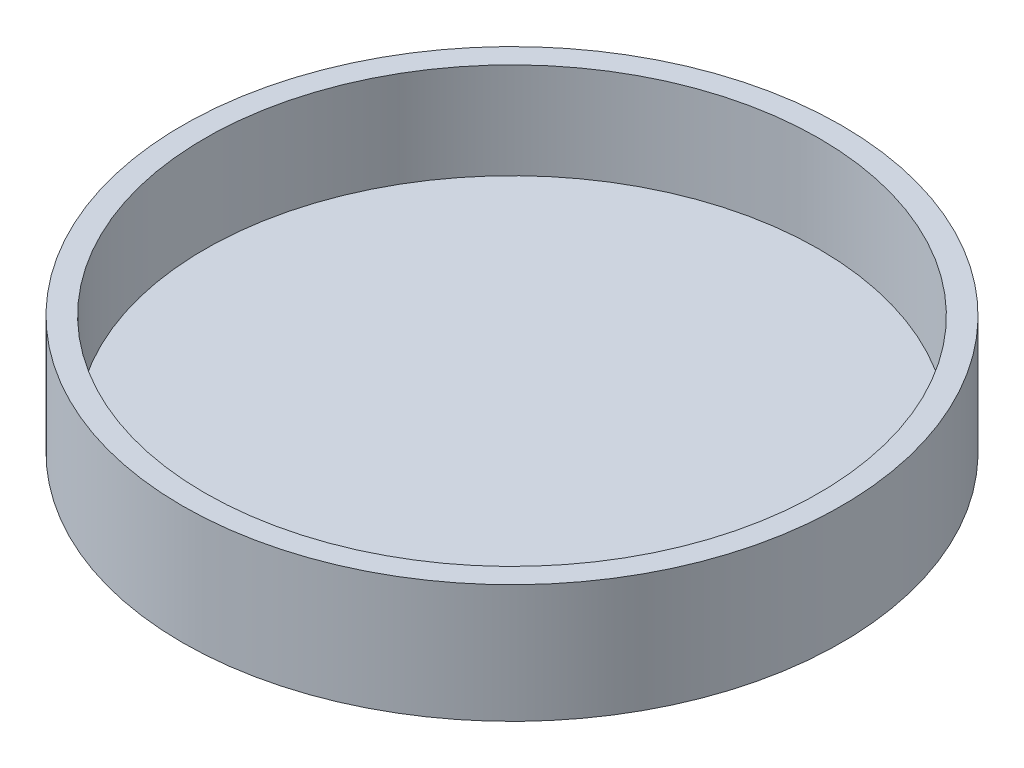
ISO-10303-21;
HEADER;
FILE_DESCRIPTION(('STEP AP214'),'2;1');
FILE_NAME('part.step','',(''),(''),'','','');
FILE_SCHEMA(('AUTOMOTIVE_DESIGN { 1 0 10303 214 1 1 1 1 }'));
ENDSEC;
DATA;
#1=APPLICATION_CONTEXT('core data for automotive mechanical design processes');
#2=APPLICATION_PROTOCOL_DEFINITION('international standard','automotive_design',2000,#1);
#3=PRODUCT_CONTEXT('',#1,'mechanical');
#4=PRODUCT('Part','Part','',(#3));
#5=PRODUCT_RELATED_PRODUCT_CATEGORY('part','',(#4));
#6=PRODUCT_DEFINITION_FORMATION('','',#4);
#7=PRODUCT_DEFINITION_CONTEXT('part definition',#1,'design');
#8=PRODUCT_DEFINITION('design','',#6,#7);
#9=PRODUCT_DEFINITION_SHAPE('','',#8);
#10=(LENGTH_UNIT() NAMED_UNIT(*) SI_UNIT(.MILLI.,.METRE.));
#11=(NAMED_UNIT(*) PLANE_ANGLE_UNIT() SI_UNIT($,.RADIAN.));
#12=(NAMED_UNIT(*) SI_UNIT($,.STERADIAN.) SOLID_ANGLE_UNIT());
#13=UNCERTAINTY_MEASURE_WITH_UNIT(LENGTH_MEASURE(1.E-05),#10,'distance_accuracy_value','');
#14=(GEOMETRIC_REPRESENTATION_CONTEXT(3) GLOBAL_UNCERTAINTY_ASSIGNED_CONTEXT((#13)) GLOBAL_UNIT_ASSIGNED_CONTEXT((#10,
#11,#12)) REPRESENTATION_CONTEXT('',''));
#15=CARTESIAN_POINT('',(0.,0.,0.));
#16=DIRECTION('',(0.,0.,1.));
#17=DIRECTION('',(1.,0.,0.));
#18=AXIS2_PLACEMENT_3D('',#15,#16,#17);
#19=CARTESIAN_POINT('',(0.,25.,0.));
#20=DIRECTION('',(0.,-1.,0.));
#21=DIRECTION('',(0.,0.,-1.));
#22=AXIS2_PLACEMENT_3D('',#19,#20,#21);
#23=CYLINDRICAL_SURFACE('',#22,51.5);
#24=CARTESIAN_POINT('',(0.,25.,0.));
#25=DIRECTION('',(0.,1.,0.));
#26=DIRECTION('',(0.,0.,1.));
#27=AXIS2_PLACEMENT_3D('',#24,#25,#26);
#28=CIRCLE('',#27,51.5);
#29=CARTESIAN_POINT('',(0.,25.,51.5));
#30=VERTEX_POINT('',#29);
#31=EDGE_CURVE('E10',#30,#30,#28,.T.);
#32=ORIENTED_EDGE('',*,*,#31,.F.);
#33=EDGE_LOOP('',(#32));
#34=FACE_BOUND('',#33,.T.);
#35=CARTESIAN_POINT('',(0.,6.5,0.));
#36=DIRECTION('',(0.,1.,0.));
#37=DIRECTION('',(0.,0.,1.));
#38=AXIS2_PLACEMENT_3D('',#35,#36,#37);
#39=CIRCLE('',#38,51.5);
#40=CARTESIAN_POINT('',(0.,6.5,51.5));
#41=VERTEX_POINT('',#40);
#42=EDGE_CURVE('E44',#41,#41,#39,.T.);
#43=ORIENTED_EDGE('',*,*,#42,.T.);
#44=EDGE_LOOP('',(#43));
#45=FACE_BOUND('',#44,.T.);
#46=ADVANCED_FACE('F37',(#34,#45),#23,.T.);
#47=CARTESIAN_POINT('',(0.,25.,0.));
#48=DIRECTION('',(0.,1.,0.));
#49=DIRECTION('',(0.,0.,1.));
#50=AXIS2_PLACEMENT_3D('',#47,#48,#49);
#51=PLANE('',#50);
#52=CARTESIAN_POINT('',(0.,25.,0.));
#53=DIRECTION('',(0.,1.,0.));
#54=DIRECTION('',(0.,0.,1.));
#55=AXIS2_PLACEMENT_3D('',#52,#53,#54);
#56=CIRCLE('',#55,48.);
#57=CARTESIAN_POINT('',(0.,25.,48.));
#58=VERTEX_POINT('',#57);
#59=EDGE_CURVE('E40',#58,#58,#56,.F.);
#60=ORIENTED_EDGE('',*,*,#59,.T.);
#61=EDGE_LOOP('',(#60));
#62=FACE_BOUND('',#61,.T.);
#63=ORIENTED_EDGE('',*,*,#31,.T.);
#64=EDGE_LOOP('',(#63));
#65=FACE_BOUND('',#64,.T.);
#66=ADVANCED_FACE('F57',(#62,#65),#51,.T.);
#67=CARTESIAN_POINT('',(0.,6.5,0.));
#68=DIRECTION('',(0.,1.,0.));
#69=DIRECTION('',(0.,0.,1.));
#70=AXIS2_PLACEMENT_3D('',#67,#68,#69);
#71=PLANE('',#70);
#72=ORIENTED_EDGE('',*,*,#42,.F.);
#73=EDGE_LOOP('',(#72));
#74=FACE_BOUND('',#73,.T.);
#75=ADVANCED_FACE('F63',(#74),#71,.F.);
#76=CARTESIAN_POINT('',(0.,26.,0.));
#77=DIRECTION('',(0.,-1.,0.));
#78=DIRECTION('',(0.,0.,-1.));
#79=AXIS2_PLACEMENT_3D('',#76,#77,#78);
#80=CYLINDRICAL_SURFACE('',#79,48.);
#81=ORIENTED_EDGE('',*,*,#59,.F.);
#82=EDGE_LOOP('',(#81));
#83=FACE_BOUND('',#82,.T.);
#84=CARTESIAN_POINT('',(0.,10.,0.));
#85=DIRECTION('',(0.,1.,0.));
#86=DIRECTION('',(0.,0.,1.));
#87=AXIS2_PLACEMENT_3D('',#84,#85,#86);
#88=CIRCLE('',#87,48.);
#89=CARTESIAN_POINT('',(0.,10.,48.));
#90=VERTEX_POINT('',#89);
#91=EDGE_CURVE('E50',#90,#90,#88,.T.);
#92=ORIENTED_EDGE('',*,*,#91,.F.);
#93=EDGE_LOOP('',(#92));
#94=FACE_BOUND('',#93,.T.);
#95=ADVANCED_FACE('F59',(#83,#94),#80,.F.);
#96=CARTESIAN_POINT('',(0.,10.,0.));
#97=DIRECTION('',(0.,1.,0.));
#98=DIRECTION('',(0.,0.,1.));
#99=AXIS2_PLACEMENT_3D('',#96,#97,#98);
#100=PLANE('',#99);
#101=ORIENTED_EDGE('',*,*,#91,.T.);
#102=EDGE_LOOP('',(#101));
#103=FACE_BOUND('',#102,.T.);
#104=ADVANCED_FACE('F62',(#103),#100,.T.);
#105=CLOSED_SHELL('',(#46,#66,#75,#95,#104));
#106=MANIFOLD_SOLID_BREP('B2',#105);
#107=ADVANCED_BREP_SHAPE_REPRESENTATION('',(#18,#106),#14);
#108=SHAPE_DEFINITION_REPRESENTATION(#9,#107);
ENDSEC;
END-ISO-10303-21;
